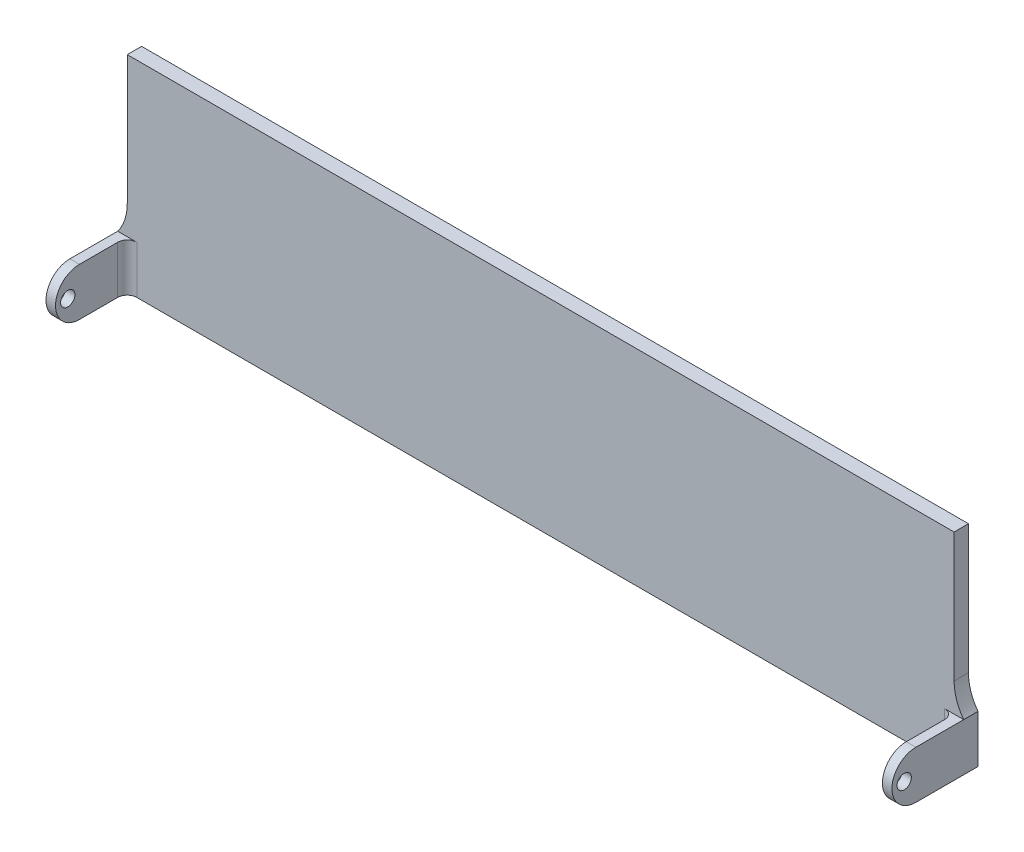
ISO-10303-21;
HEADER;
FILE_DESCRIPTION(('STEP AP214'),'2;1');
FILE_NAME('part.step','',(''),(''),'','','');
FILE_SCHEMA(('AUTOMOTIVE_DESIGN { 1 0 10303 214 1 1 1 1 }'));
ENDSEC;
DATA;
#1=APPLICATION_CONTEXT('core data for automotive mechanical design processes');
#2=APPLICATION_PROTOCOL_DEFINITION('international standard','automotive_design',2000,#1);
#3=PRODUCT_CONTEXT('',#1,'mechanical');
#4=PRODUCT('Part','Part','',(#3));
#5=PRODUCT_RELATED_PRODUCT_CATEGORY('part','',(#4));
#6=PRODUCT_DEFINITION_FORMATION('','',#4);
#7=PRODUCT_DEFINITION_CONTEXT('part definition',#1,'design');
#8=PRODUCT_DEFINITION('design','',#6,#7);
#9=PRODUCT_DEFINITION_SHAPE('','',#8);
#10=(LENGTH_UNIT() NAMED_UNIT(*) SI_UNIT(.MILLI.,.METRE.));
#11=(NAMED_UNIT(*) PLANE_ANGLE_UNIT() SI_UNIT($,.RADIAN.));
#12=(NAMED_UNIT(*) SI_UNIT($,.STERADIAN.) SOLID_ANGLE_UNIT());
#13=UNCERTAINTY_MEASURE_WITH_UNIT(LENGTH_MEASURE(1.E-05),#10,'distance_accuracy_value','');
#14=(GEOMETRIC_REPRESENTATION_CONTEXT(3) GLOBAL_UNCERTAINTY_ASSIGNED_CONTEXT((#13)) GLOBAL_UNIT_ASSIGNED_CONTEXT((#10,
#11,#12)) REPRESENTATION_CONTEXT('',''));
#15=CARTESIAN_POINT('',(0.,0.,0.));
#16=DIRECTION('',(0.,0.,1.));
#17=DIRECTION('',(1.,0.,0.));
#18=AXIS2_PLACEMENT_3D('',#15,#16,#17);
#19=CARTESIAN_POINT('',(86.5,-21.5,3.));
#20=DIRECTION('',(-1.,0.,0.));
#21=DIRECTION('',(0.,0.,1.));
#22=AXIS2_PLACEMENT_3D('',#19,#20,#21);
#23=PLANE('',#22);
#24=DIRECTION('',(0.,1.,0.));
#25=VECTOR('',#24,1.);
#26=CARTESIAN_POINT('',(86.5,-21.5,3.));
#27=LINE('',#26,#25);
#28=CARTESIAN_POINT('',(86.5,-5.49999999999999,3.));
#29=VERTEX_POINT('',#28);
#30=CARTESIAN_POINT('',(86.5,21.5,3.));
#31=VERTEX_POINT('',#30);
#32=EDGE_CURVE('E255',#29,#31,#27,.T.);
#33=ORIENTED_EDGE('',*,*,#32,.F.);
#34=DIRECTION('',(0.,0.,-1.));
#35=VECTOR('',#34,1.);
#36=CARTESIAN_POINT('',(86.5,-5.49999999999999,3.));
#37=LINE('',#36,#35);
#38=CARTESIAN_POINT('',(86.5,-5.49999999999999,0.));
#39=VERTEX_POINT('',#38);
#40=EDGE_CURVE('E300',#29,#39,#37,.T.);
#41=ORIENTED_EDGE('',*,*,#40,.T.);
#42=DIRECTION('',(0.,1.,0.));
#43=VECTOR('',#42,1.);
#44=CARTESIAN_POINT('',(86.5,-21.5,0.));
#45=LINE('',#44,#43);
#46=CARTESIAN_POINT('',(86.5,21.5,0.));
#47=VERTEX_POINT('',#46);
#48=EDGE_CURVE('E245',#39,#47,#45,.T.);
#49=ORIENTED_EDGE('',*,*,#48,.T.);
#50=DIRECTION('',(0.,0.,-1.));
#51=VECTOR('',#50,1.);
#52=CARTESIAN_POINT('',(86.5,21.5,3.));
#53=LINE('',#52,#51);
#54=EDGE_CURVE('E285',#31,#47,#53,.T.);
#55=ORIENTED_EDGE('',*,*,#54,.F.);
#56=EDGE_LOOP('',(#33,#41,#49,#55));
#57=FACE_BOUND('',#56,.T.);
#58=ADVANCED_FACE('F74',(#57),#23,.F.);
#59=CARTESIAN_POINT('',(-86.5,21.5,3.));
#60=DIRECTION('',(0.,-1.,0.));
#61=DIRECTION('',(0.,0.,-1.));
#62=AXIS2_PLACEMENT_3D('',#59,#60,#61);
#63=PLANE('',#62);
#64=DIRECTION('',(-1.,0.,0.));
#65=VECTOR('',#64,1.);
#66=CARTESIAN_POINT('',(-86.5,21.5,0.));
#67=LINE('',#66,#65);
#68=CARTESIAN_POINT('',(-86.5,21.5,0.));
#69=VERTEX_POINT('',#68);
#70=EDGE_CURVE('E273',#47,#69,#67,.T.);
#71=ORIENTED_EDGE('',*,*,#70,.T.);
#72=DIRECTION('',(0.,0.,-1.));
#73=VECTOR('',#72,1.);
#74=CARTESIAN_POINT('',(-86.5,21.5,3.));
#75=LINE('',#74,#73);
#76=CARTESIAN_POINT('',(-86.5,21.5,3.));
#77=VERTEX_POINT('',#76);
#78=EDGE_CURVE('E270',#77,#69,#75,.T.);
#79=ORIENTED_EDGE('',*,*,#78,.F.);
#80=DIRECTION('',(-1.,0.,0.));
#81=VECTOR('',#80,1.);
#82=CARTESIAN_POINT('',(-86.5,21.5,3.));
#83=LINE('',#82,#81);
#84=EDGE_CURVE('E258',#31,#77,#83,.T.);
#85=ORIENTED_EDGE('',*,*,#84,.F.);
#86=ORIENTED_EDGE('',*,*,#54,.T.);
#87=EDGE_LOOP('',(#71,#79,#85,#86));
#88=FACE_BOUND('',#87,.T.);
#89=ADVANCED_FACE('F380',(#88),#63,.F.);
#90=CARTESIAN_POINT('',(-86.5,-21.5,3.));
#91=DIRECTION('',(1.,0.,0.));
#92=DIRECTION('',(0.,0.,-1.));
#93=AXIS2_PLACEMENT_3D('',#90,#91,#92);
#94=PLANE('',#93);
#95=DIRECTION('',(0.,-1.,0.));
#96=VECTOR('',#95,1.);
#97=CARTESIAN_POINT('',(-86.5,-21.5,0.));
#98=LINE('',#97,#96);
#99=CARTESIAN_POINT('',(-86.5,-5.49999999999999,0.));
#100=VERTEX_POINT('',#99);
#101=EDGE_CURVE('E276',#69,#100,#98,.T.);
#102=ORIENTED_EDGE('',*,*,#101,.T.);
#103=DIRECTION('',(0.,0.,1.));
#104=VECTOR('',#103,1.);
#105=CARTESIAN_POINT('',(-86.5,-5.49999999999999,3.));
#106=LINE('',#105,#104);
#107=CARTESIAN_POINT('',(-86.5,-5.49999999999999,3.));
#108=VERTEX_POINT('',#107);
#109=EDGE_CURVE('E289',#100,#108,#106,.T.);
#110=ORIENTED_EDGE('',*,*,#109,.T.);
#111=DIRECTION('',(0.,-1.,0.));
#112=VECTOR('',#111,1.);
#113=CARTESIAN_POINT('',(-86.5,-21.5,3.));
#114=LINE('',#113,#112);
#115=EDGE_CURVE('E262',#77,#108,#114,.T.);
#116=ORIENTED_EDGE('',*,*,#115,.F.);
#117=ORIENTED_EDGE('',*,*,#78,.T.);
#118=EDGE_LOOP('',(#102,#110,#116,#117));
#119=FACE_BOUND('',#118,.T.);
#120=ADVANCED_FACE('F388',(#119),#94,.F.);
#121=CARTESIAN_POINT('',(-86.5,-21.5,3.));
#122=DIRECTION('',(0.,1.,0.));
#123=DIRECTION('',(0.,0.,1.));
#124=AXIS2_PLACEMENT_3D('',#121,#122,#123);
#125=PLANE('',#124);
#126=DIRECTION('',(1.,0.,0.));
#127=VECTOR('',#126,1.);
#128=CARTESIAN_POINT('',(-86.5,-21.5,0.));
#129=LINE('',#128,#127);
#130=CARTESIAN_POINT('',(-88.5,-21.5,0.));
#131=VERTEX_POINT('',#130);
#132=CARTESIAN_POINT('',(88.5,-21.5,0.));
#133=VERTEX_POINT('',#132);
#134=EDGE_CURVE('E259',#131,#133,#129,.T.);
#135=ORIENTED_EDGE('',*,*,#134,.T.);
#136=DIRECTION('',(0.,0.,1.));
#137=VECTOR('',#136,1.);
#138=CARTESIAN_POINT('',(88.5,-21.5,0.));
#139=LINE('',#138,#137);
#140=CARTESIAN_POINT('',(88.5,-21.5,13.));
#141=VERTEX_POINT('',#140);
#142=EDGE_CURVE('E339',#133,#141,#139,.T.);
#143=ORIENTED_EDGE('',*,*,#142,.T.);
#144=DIRECTION('',(-1.,0.,0.));
#145=VECTOR('',#144,1.);
#146=CARTESIAN_POINT('',(88.5,-21.5,13.));
#147=LINE('',#146,#145);
#148=CARTESIAN_POINT('',(86.5,-21.5,13.));
#149=VERTEX_POINT('',#148);
#150=EDGE_CURVE('E206',#141,#149,#147,.T.);
#151=ORIENTED_EDGE('',*,*,#150,.T.);
#152=DIRECTION('',(0.,0.,1.));
#153=VECTOR('',#152,1.);
#154=CARTESIAN_POINT('',(86.5,-21.5,0.));
#155=LINE('',#154,#153);
#156=CARTESIAN_POINT('',(86.5,-21.5,5.));
#157=VERTEX_POINT('',#156);
#158=EDGE_CURVE('E194',#157,#149,#155,.T.);
#159=ORIENTED_EDGE('',*,*,#158,.F.);
#160=CARTESIAN_POINT('',(84.5,-21.5,5.));
#161=DIRECTION('',(0.,1.,0.));
#162=DIRECTION('',(0.,0.,1.));
#163=AXIS2_PLACEMENT_3D('',#160,#161,#162);
#164=CIRCLE('',#163,2.);
#165=CARTESIAN_POINT('',(84.5,-21.5,3.));
#166=VERTEX_POINT('',#165);
#167=EDGE_CURVE('E331',#157,#166,#164,.T.);
#168=ORIENTED_EDGE('',*,*,#167,.T.);
#169=DIRECTION('',(1.,0.,0.));
#170=VECTOR('',#169,1.);
#171=CARTESIAN_POINT('',(-86.5,-21.5,3.));
#172=LINE('',#171,#170);
#173=CARTESIAN_POINT('',(-84.5,-21.5,3.));
#174=VERTEX_POINT('',#173);
#175=EDGE_CURVE('E266',#174,#166,#172,.T.);
#176=ORIENTED_EDGE('',*,*,#175,.F.);
#177=CARTESIAN_POINT('',(-84.5,-21.5,5.));
#178=DIRECTION('',(0.,1.,0.));
#179=DIRECTION('',(0.,0.,1.));
#180=AXIS2_PLACEMENT_3D('',#177,#178,#179);
#181=CIRCLE('',#180,2.);
#182=CARTESIAN_POINT('',(-86.5,-21.5,5.));
#183=VERTEX_POINT('',#182);
#184=EDGE_CURVE('E83',#174,#183,#181,.T.);
#185=ORIENTED_EDGE('',*,*,#184,.T.);
#186=DIRECTION('',(0.,0.,1.));
#187=VECTOR('',#186,1.);
#188=CARTESIAN_POINT('',(-86.5,-21.5,0.));
#189=LINE('',#188,#187);
#190=CARTESIAN_POINT('',(-86.5,-21.5,13.));
#191=VERTEX_POINT('',#190);
#192=EDGE_CURVE('E237',#183,#191,#189,.T.);
#193=ORIENTED_EDGE('',*,*,#192,.T.);
#194=DIRECTION('',(1.,0.,0.));
#195=VECTOR('',#194,1.);
#196=CARTESIAN_POINT('',(-88.5,-21.5,13.));
#197=LINE('',#196,#195);
#198=CARTESIAN_POINT('',(-88.5,-21.5,13.));
#199=VERTEX_POINT('',#198);
#200=EDGE_CURVE('E241',#199,#191,#197,.T.);
#201=ORIENTED_EDGE('',*,*,#200,.F.);
#202=DIRECTION('',(0.,0.,1.));
#203=VECTOR('',#202,1.);
#204=CARTESIAN_POINT('',(-88.5,-21.5,0.));
#205=LINE('',#204,#203);
#206=EDGE_CURVE('E224',#131,#199,#205,.T.);
#207=ORIENTED_EDGE('',*,*,#206,.F.);
#208=EDGE_LOOP('',(#135,#143,#151,#159,#168,#176,#185,#193,#201,#207));
#209=FACE_BOUND('',#208,.T.);
#210=ADVANCED_FACE('F412',(#209),#125,.F.);
#211=CARTESIAN_POINT('',(0.,0.,3.));
#212=DIRECTION('',(0.,0.,-1.));
#213=DIRECTION('',(-1.,0.,0.));
#214=AXIS2_PLACEMENT_3D('',#211,#212,#213);
#215=PLANE('',#214);
#216=ORIENTED_EDGE('',*,*,#175,.T.);
#217=DIRECTION('',(0.,1.,0.));
#218=VECTOR('',#217,1.);
#219=CARTESIAN_POINT('',(84.5,0.,3.));
#220=LINE('',#219,#218);
#221=CARTESIAN_POINT('',(84.5,-11.5,3.));
#222=VERTEX_POINT('',#221);
#223=EDGE_CURVE('E319',#166,#222,#220,.T.);
#224=ORIENTED_EDGE('',*,*,#223,.T.);
#225=DIRECTION('',(-1.,0.,0.));
#226=VECTOR('',#225,1.);
#227=CARTESIAN_POINT('',(0.,-11.5,3.));
#228=LINE('',#227,#226);
#229=CARTESIAN_POINT('',(88.5,-11.5,3.));
#230=VERTEX_POINT('',#229);
#231=EDGE_CURVE('E297',#230,#222,#228,.T.);
#232=ORIENTED_EDGE('',*,*,#231,.F.);
#233=CARTESIAN_POINT('',(96.5,-5.49999999999999,3.));
#234=DIRECTION('',(0.,0.,-1.));
#235=DIRECTION('',(-1.,0.,0.));
#236=AXIS2_PLACEMENT_3D('',#233,#234,#235);
#237=CIRCLE('',#236,10.);
#238=EDGE_CURVE('E309',#230,#29,#237,.T.);
#239=ORIENTED_EDGE('',*,*,#238,.T.);
#240=ORIENTED_EDGE('',*,*,#32,.T.);
#241=ORIENTED_EDGE('',*,*,#84,.T.);
#242=ORIENTED_EDGE('',*,*,#115,.T.);
#243=CARTESIAN_POINT('',(-96.5,-5.49999999999999,3.));
#244=DIRECTION('',(0.,0.,-1.));
#245=DIRECTION('',(-1.,0.,0.));
#246=AXIS2_PLACEMENT_3D('',#243,#244,#245);
#247=CIRCLE('',#246,10.);
#248=CARTESIAN_POINT('',(-88.5,-11.5,3.));
#249=VERTEX_POINT('',#248);
#250=EDGE_CURVE('E303',#108,#249,#247,.T.);
#251=ORIENTED_EDGE('',*,*,#250,.T.);
#252=DIRECTION('',(-1.,0.,0.));
#253=VECTOR('',#252,1.);
#254=CARTESIAN_POINT('',(-88.5,-11.5,3.));
#255=LINE('',#254,#253);
#256=CARTESIAN_POINT('',(-84.5,-11.5,3.));
#257=VERTEX_POINT('',#256);
#258=EDGE_CURVE('E293',#257,#249,#255,.T.);
#259=ORIENTED_EDGE('',*,*,#258,.F.);
#260=DIRECTION('',(0.,-1.,0.));
#261=VECTOR('',#260,1.);
#262=CARTESIAN_POINT('',(-84.5,-21.5,3.));
#263=LINE('',#262,#261);
#264=EDGE_CURVE('E315',#257,#174,#263,.T.);
#265=ORIENTED_EDGE('',*,*,#264,.T.);
#266=EDGE_LOOP('',(#216,#224,#232,#239,#240,#241,#242,#251,#259,#265));
#267=FACE_BOUND('',#266,.T.);
#268=ADVANCED_FACE('F414',(#267),#215,.F.);
#269=CARTESIAN_POINT('',(0.,0.,0.));
#270=DIRECTION('',(0.,0.,-1.));
#271=DIRECTION('',(-1.,0.,0.));
#272=AXIS2_PLACEMENT_3D('',#269,#270,#271);
#273=PLANE('',#272);
#274=ORIENTED_EDGE('',*,*,#48,.F.);
#275=CARTESIAN_POINT('',(96.5,-5.49999999999999,0.));
#276=DIRECTION('',(0.,0.,-1.));
#277=DIRECTION('',(-1.,0.,0.));
#278=AXIS2_PLACEMENT_3D('',#275,#276,#277);
#279=CIRCLE('',#278,10.);
#280=CARTESIAN_POINT('',(88.5,-11.5,0.));
#281=VERTEX_POINT('',#280);
#282=EDGE_CURVE('E312',#39,#281,#279,.F.);
#283=ORIENTED_EDGE('',*,*,#282,.T.);
#284=DIRECTION('',(0.,1.,0.));
#285=VECTOR('',#284,1.);
#286=CARTESIAN_POINT('',(88.5,-21.5,0.));
#287=LINE('',#286,#285);
#288=EDGE_CURVE('E337',#133,#281,#287,.T.);
#289=ORIENTED_EDGE('',*,*,#288,.F.);
#290=ORIENTED_EDGE('',*,*,#134,.F.);
#291=DIRECTION('',(0.,1.,0.));
#292=VECTOR('',#291,1.);
#293=CARTESIAN_POINT('',(-88.5,-21.5,0.));
#294=LINE('',#293,#292);
#295=CARTESIAN_POINT('',(-88.5,-11.5,0.));
#296=VERTEX_POINT('',#295);
#297=EDGE_CURVE('E229',#131,#296,#294,.T.);
#298=ORIENTED_EDGE('',*,*,#297,.T.);
#299=CARTESIAN_POINT('',(-96.5,-5.49999999999999,0.));
#300=DIRECTION('',(0.,0.,-1.));
#301=DIRECTION('',(-1.,0.,0.));
#302=AXIS2_PLACEMENT_3D('',#299,#300,#301);
#303=CIRCLE('',#302,10.);
#304=EDGE_CURVE('E306',#296,#100,#303,.F.);
#305=ORIENTED_EDGE('',*,*,#304,.T.);
#306=ORIENTED_EDGE('',*,*,#101,.F.);
#307=ORIENTED_EDGE('',*,*,#70,.F.);
#308=EDGE_LOOP('',(#274,#283,#289,#290,#298,#305,#306,#307));
#309=FACE_BOUND('',#308,.T.);
#310=ADVANCED_FACE('F435',(#309),#273,.T.);
#311=CARTESIAN_POINT('',(-88.5,-11.5,0.));
#312=DIRECTION('',(0.,1.,0.));
#313=DIRECTION('',(0.,0.,1.));
#314=AXIS2_PLACEMENT_3D('',#311,#312,#313);
#315=PLANE('',#314);
#316=DIRECTION('',(0.,0.,1.));
#317=VECTOR('',#316,1.);
#318=CARTESIAN_POINT('',(-86.5,-11.5,0.));
#319=LINE('',#318,#317);
#320=CARTESIAN_POINT('',(-86.5,-11.5,5.));
#321=VERTEX_POINT('',#320);
#322=CARTESIAN_POINT('',(-86.5,-11.5,13.));
#323=VERTEX_POINT('',#322);
#324=EDGE_CURVE('E234',#321,#323,#319,.T.);
#325=ORIENTED_EDGE('',*,*,#324,.F.);
#326=CARTESIAN_POINT('',(-84.5,-11.5,5.));
#327=DIRECTION('',(0.,1.,0.));
#328=DIRECTION('',(0.,0.,1.));
#329=AXIS2_PLACEMENT_3D('',#326,#327,#328);
#330=CIRCLE('',#329,2.);
#331=EDGE_CURVE('E12',#321,#257,#330,.F.);
#332=ORIENTED_EDGE('',*,*,#331,.T.);
#333=ORIENTED_EDGE('',*,*,#258,.T.);
#334=DIRECTION('',(0.,0.,1.));
#335=VECTOR('',#334,1.);
#336=CARTESIAN_POINT('',(-88.5,-11.5,0.));
#337=LINE('',#336,#335);
#338=CARTESIAN_POINT('',(-88.5,-11.5,13.));
#339=VERTEX_POINT('',#338);
#340=EDGE_CURVE('E225',#249,#339,#337,.T.);
#341=ORIENTED_EDGE('',*,*,#340,.T.);
#342=DIRECTION('',(1.,0.,0.));
#343=VECTOR('',#342,1.);
#344=CARTESIAN_POINT('',(-88.5,-11.5,13.));
#345=LINE('',#344,#343);
#346=EDGE_CURVE('E233',#339,#323,#345,.T.);
#347=ORIENTED_EDGE('',*,*,#346,.T.);
#348=EDGE_LOOP('',(#325,#332,#333,#341,#347));
#349=FACE_BOUND('',#348,.T.);
#350=ADVANCED_FACE('F419',(#349),#315,.T.);
#351=CARTESIAN_POINT('',(-86.5,0.,0.));
#352=DIRECTION('',(-1.,0.,0.));
#353=DIRECTION('',(0.,0.,1.));
#354=AXIS2_PLACEMENT_3D('',#351,#352,#353);
#355=PLANE('',#354);
#356=CARTESIAN_POINT('',(-86.5,-16.5,15.4464731585));
#357=DIRECTION('',(-1.,0.,0.));
#358=DIRECTION('',(0.,0.,1.));
#359=AXIS2_PLACEMENT_3D('',#356,#357,#358);
#360=CIRCLE('',#359,1.5);
#361=CARTESIAN_POINT('',(-86.5,-16.5,16.9464731585));
#362=VERTEX_POINT('',#361);
#363=EDGE_CURVE('E216',#362,#362,#360,.T.);
#364=ORIENTED_EDGE('',*,*,#363,.T.);
#365=EDGE_LOOP('',(#364));
#366=FACE_BOUND('',#365,.T.);
#367=ORIENTED_EDGE('',*,*,#192,.F.);
#368=DIRECTION('',(0.,-1.,0.));
#369=VECTOR('',#368,1.);
#370=CARTESIAN_POINT('',(-86.5,-11.5,5.));
#371=LINE('',#370,#369);
#372=EDGE_CURVE('E96',#183,#321,#371,.F.);
#373=ORIENTED_EDGE('',*,*,#372,.T.);
#374=ORIENTED_EDGE('',*,*,#324,.T.);
#375=CARTESIAN_POINT('',(-86.5,-16.5,13.));
#376=DIRECTION('',(-1.,0.,0.));
#377=DIRECTION('',(0.,0.,1.));
#378=AXIS2_PLACEMENT_3D('',#375,#376,#377);
#379=CIRCLE('',#378,5.);
#380=EDGE_CURVE('E205',#191,#323,#379,.T.);
#381=ORIENTED_EDGE('',*,*,#380,.F.);
#382=EDGE_LOOP('',(#367,#373,#374,#381));
#383=FACE_BOUND('',#382,.T.);
#384=ADVANCED_FACE('F423',(#366,#383),#355,.F.);
#385=CARTESIAN_POINT('',(-88.5,0.,0.));
#386=DIRECTION('',(-1.,0.,0.));
#387=DIRECTION('',(0.,0.,1.));
#388=AXIS2_PLACEMENT_3D('',#385,#386,#387);
#389=PLANE('',#388);
#390=CARTESIAN_POINT('',(-88.5,-16.5,15.4464731585));
#391=DIRECTION('',(-1.,0.,0.));
#392=DIRECTION('',(0.,0.,1.));
#393=AXIS2_PLACEMENT_3D('',#390,#391,#392);
#394=CIRCLE('',#393,1.5);
#395=CARTESIAN_POINT('',(-88.5,-16.5,16.9464731585));
#396=VERTEX_POINT('',#395);
#397=EDGE_CURVE('E351',#396,#396,#394,.T.);
#398=ORIENTED_EDGE('',*,*,#397,.F.);
#399=EDGE_LOOP('',(#398));
#400=FACE_BOUND('',#399,.T.);
#401=ORIENTED_EDGE('',*,*,#206,.T.);
#402=CARTESIAN_POINT('',(-88.5,-16.5,13.));
#403=DIRECTION('',(-1.,0.,0.));
#404=DIRECTION('',(0.,0.,1.));
#405=AXIS2_PLACEMENT_3D('',#402,#403,#404);
#406=CIRCLE('',#405,5.);
#407=EDGE_CURVE('E238',#199,#339,#406,.T.);
#408=ORIENTED_EDGE('',*,*,#407,.T.);
#409=ORIENTED_EDGE('',*,*,#340,.F.);
#410=EDGE_CURVE('E220',#296,#249,#337,.T.);
#411=ORIENTED_EDGE('',*,*,#410,.F.);
#412=ORIENTED_EDGE('',*,*,#297,.F.);
#413=EDGE_LOOP('',(#401,#408,#409,#411,#412));
#414=FACE_BOUND('',#413,.T.);
#415=ADVANCED_FACE('F431',(#400,#414),#389,.T.);
#416=CARTESIAN_POINT('',(-88.5,-16.5,13.));
#417=DIRECTION('',(1.,0.,0.));
#418=DIRECTION('',(0.,0.,-1.));
#419=AXIS2_PLACEMENT_3D('',#416,#417,#418);
#420=CYLINDRICAL_SURFACE('',#419,5.);
#421=ORIENTED_EDGE('',*,*,#380,.T.);
#422=ORIENTED_EDGE('',*,*,#346,.F.);
#423=ORIENTED_EDGE('',*,*,#407,.F.);
#424=ORIENTED_EDGE('',*,*,#200,.T.);
#425=EDGE_LOOP('',(#421,#422,#423,#424));
#426=FACE_BOUND('',#425,.T.);
#427=ADVANCED_FACE('F425',(#426),#420,.T.);
#428=CARTESIAN_POINT('',(86.5,0.,0.));
#429=DIRECTION('',(-1.,0.,0.));
#430=DIRECTION('',(0.,0.,1.));
#431=AXIS2_PLACEMENT_3D('',#428,#429,#430);
#432=PLANE('',#431);
#433=CARTESIAN_POINT('',(86.5,-16.5,15.4464731585));
#434=DIRECTION('',(-1.,0.,0.));
#435=DIRECTION('',(0.,0.,1.));
#436=AXIS2_PLACEMENT_3D('',#433,#434,#435);
#437=CIRCLE('',#436,1.5);
#438=CARTESIAN_POINT('',(86.5,-16.5,16.9464731585));
#439=VERTEX_POINT('',#438);
#440=EDGE_CURVE('E355',#439,#439,#437,.T.);
#441=ORIENTED_EDGE('',*,*,#440,.F.);
#442=EDGE_LOOP('',(#441));
#443=FACE_BOUND('',#442,.T.);
#444=DIRECTION('',(0.,0.,1.));
#445=VECTOR('',#444,1.);
#446=CARTESIAN_POINT('',(86.5,-11.5,0.));
#447=LINE('',#446,#445);
#448=CARTESIAN_POINT('',(86.5,-11.5,5.));
#449=VERTEX_POINT('',#448);
#450=CARTESIAN_POINT('',(86.5,-11.5,13.));
#451=VERTEX_POINT('',#450);
#452=EDGE_CURVE('E200',#449,#451,#447,.T.);
#453=ORIENTED_EDGE('',*,*,#452,.F.);
#454=DIRECTION('',(0.,1.,0.));
#455=VECTOR('',#454,1.);
#456=CARTESIAN_POINT('',(86.5,0.,5.));
#457=LINE('',#456,#455);
#458=EDGE_CURVE('E323',#449,#157,#457,.F.);
#459=ORIENTED_EDGE('',*,*,#458,.T.);
#460=ORIENTED_EDGE('',*,*,#158,.T.);
#461=CARTESIAN_POINT('',(86.5,-16.5,13.));
#462=DIRECTION('',(1.,0.,0.));
#463=DIRECTION('',(0.,0.,-1.));
#464=AXIS2_PLACEMENT_3D('',#461,#462,#463);
#465=CIRCLE('',#464,4.99999999999998);
#466=EDGE_CURVE('E211',#451,#149,#465,.T.);
#467=ORIENTED_EDGE('',*,*,#466,.F.);
#468=EDGE_LOOP('',(#453,#459,#460,#467));
#469=FACE_BOUND('',#468,.T.);
#470=ADVANCED_FACE('F375',(#443,#469),#432,.T.);
#471=CARTESIAN_POINT('',(88.5,-11.5,0.));
#472=DIRECTION('',(0.,-1.,0.));
#473=DIRECTION('',(0.,0.,-1.));
#474=AXIS2_PLACEMENT_3D('',#471,#472,#473);
#475=PLANE('',#474);
#476=DIRECTION('',(0.,0.,1.));
#477=VECTOR('',#476,1.);
#478=CARTESIAN_POINT('',(88.5,-11.5,0.));
#479=LINE('',#478,#477);
#480=CARTESIAN_POINT('',(88.5,-11.5,13.));
#481=VERTEX_POINT('',#480);
#482=EDGE_CURVE('E182',#230,#481,#479,.T.);
#483=ORIENTED_EDGE('',*,*,#482,.F.);
#484=ORIENTED_EDGE('',*,*,#231,.T.);
#485=CARTESIAN_POINT('',(84.5,-11.5,5.));
#486=DIRECTION('',(0.,-1.,0.));
#487=DIRECTION('',(0.,0.,-1.));
#488=AXIS2_PLACEMENT_3D('',#485,#486,#487);
#489=CIRCLE('',#488,2.);
#490=EDGE_CURVE('E328',#222,#449,#489,.T.);
#491=ORIENTED_EDGE('',*,*,#490,.T.);
#492=ORIENTED_EDGE('',*,*,#452,.T.);
#493=DIRECTION('',(-1.,0.,0.));
#494=VECTOR('',#493,1.);
#495=CARTESIAN_POINT('',(88.5,-11.5,13.));
#496=LINE('',#495,#494);
#497=EDGE_CURVE('E197',#481,#451,#496,.T.);
#498=ORIENTED_EDGE('',*,*,#497,.F.);
#499=EDGE_LOOP('',(#483,#484,#491,#492,#498));
#500=FACE_BOUND('',#499,.T.);
#501=ADVANCED_FACE('F198',(#500),#475,.F.);
#502=CARTESIAN_POINT('',(88.5,0.,0.));
#503=DIRECTION('',(-1.,0.,0.));
#504=DIRECTION('',(0.,0.,1.));
#505=AXIS2_PLACEMENT_3D('',#502,#503,#504);
#506=PLANE('',#505);
#507=CARTESIAN_POINT('',(88.5,-16.5,15.4464731585));
#508=DIRECTION('',(1.,0.,0.));
#509=DIRECTION('',(0.,0.,-1.));
#510=AXIS2_PLACEMENT_3D('',#507,#508,#509);
#511=CIRCLE('',#510,1.5);
#512=CARTESIAN_POINT('',(88.5,-16.5,13.9464731585));
#513=VERTEX_POINT('',#512);
#514=EDGE_CURVE('E359',#513,#513,#511,.T.);
#515=ORIENTED_EDGE('',*,*,#514,.F.);
#516=EDGE_LOOP('',(#515));
#517=FACE_BOUND('',#516,.T.);
#518=EDGE_CURVE('E191',#281,#230,#479,.T.);
#519=ORIENTED_EDGE('',*,*,#518,.T.);
#520=ORIENTED_EDGE('',*,*,#482,.T.);
#521=CARTESIAN_POINT('',(88.5,-16.5,13.));
#522=DIRECTION('',(1.,0.,0.));
#523=DIRECTION('',(0.,0.,-1.));
#524=AXIS2_PLACEMENT_3D('',#521,#522,#523);
#525=CIRCLE('',#524,4.99999999999998);
#526=EDGE_CURVE('E187',#481,#141,#525,.T.);
#527=ORIENTED_EDGE('',*,*,#526,.T.);
#528=ORIENTED_EDGE('',*,*,#142,.F.);
#529=ORIENTED_EDGE('',*,*,#288,.T.);
#530=EDGE_LOOP('',(#519,#520,#527,#528,#529));
#531=FACE_BOUND('',#530,.T.);
#532=ADVANCED_FACE('F184',(#517,#531),#506,.F.);
#533=CARTESIAN_POINT('',(88.5,-16.5,13.));
#534=DIRECTION('',(-1.,0.,0.));
#535=DIRECTION('',(0.,0.,1.));
#536=AXIS2_PLACEMENT_3D('',#533,#534,#535);
#537=CYLINDRICAL_SURFACE('',#536,4.99999999999998);
#538=ORIENTED_EDGE('',*,*,#497,.T.);
#539=ORIENTED_EDGE('',*,*,#466,.T.);
#540=ORIENTED_EDGE('',*,*,#150,.F.);
#541=ORIENTED_EDGE('',*,*,#526,.F.);
#542=EDGE_LOOP('',(#538,#539,#540,#541));
#543=FACE_BOUND('',#542,.T.);
#544=ADVANCED_FACE('F208',(#543),#537,.T.);
#545=CARTESIAN_POINT('',(-111.5,-16.5,15.4464731585));
#546=DIRECTION('',(1.,0.,0.));
#547=DIRECTION('',(0.,0.,-1.));
#548=AXIS2_PLACEMENT_3D('',#545,#546,#547);
#549=CYLINDRICAL_SURFACE('',#548,1.5);
#550=ORIENTED_EDGE('',*,*,#440,.T.);
#551=EDGE_LOOP('',(#550));
#552=FACE_BOUND('',#551,.T.);
#553=ORIENTED_EDGE('',*,*,#514,.T.);
#554=EDGE_LOOP('',(#553));
#555=FACE_BOUND('',#554,.T.);
#556=ADVANCED_FACE('F364',(#552,#555),#549,.F.);
#557=ORIENTED_EDGE('',*,*,#397,.T.);
#558=EDGE_LOOP('',(#557));
#559=FACE_BOUND('',#558,.T.);
#560=ORIENTED_EDGE('',*,*,#363,.F.);
#561=EDGE_LOOP('',(#560));
#562=FACE_BOUND('',#561,.T.);
#563=ADVANCED_FACE('F397',(#559,#562),#549,.F.);
#564=CARTESIAN_POINT('',(-96.5,-5.49999999999999,0.));
#565=DIRECTION('',(0.,0.,1.));
#566=DIRECTION('',(1.,0.,0.));
#567=AXIS2_PLACEMENT_3D('',#564,#565,#566);
#568=CYLINDRICAL_SURFACE('',#567,10.);
#569=ORIENTED_EDGE('',*,*,#304,.F.);
#570=ORIENTED_EDGE('',*,*,#410,.T.);
#571=ORIENTED_EDGE('',*,*,#250,.F.);
#572=ORIENTED_EDGE('',*,*,#109,.F.);
#573=EDGE_LOOP('',(#569,#570,#571,#572));
#574=FACE_BOUND('',#573,.T.);
#575=ADVANCED_FACE('F394',(#574),#568,.F.);
#576=CARTESIAN_POINT('',(96.5,-5.49999999999999,0.));
#577=DIRECTION('',(0.,0.,-1.));
#578=DIRECTION('',(-1.,0.,0.));
#579=AXIS2_PLACEMENT_3D('',#576,#577,#578);
#580=CYLINDRICAL_SURFACE('',#579,10.);
#581=ORIENTED_EDGE('',*,*,#282,.F.);
#582=ORIENTED_EDGE('',*,*,#40,.F.);
#583=ORIENTED_EDGE('',*,*,#238,.F.);
#584=ORIENTED_EDGE('',*,*,#518,.F.);
#585=EDGE_LOOP('',(#581,#582,#583,#584));
#586=FACE_BOUND('',#585,.T.);
#587=ADVANCED_FACE('F396',(#586),#580,.F.);
#588=CARTESIAN_POINT('',(84.5,0.,5.));
#589=DIRECTION('',(0.,1.,0.));
#590=DIRECTION('',(0.,0.,1.));
#591=AXIS2_PLACEMENT_3D('',#588,#589,#590);
#592=CYLINDRICAL_SURFACE('',#591,2.);
#593=ORIENTED_EDGE('',*,*,#167,.F.);
#594=ORIENTED_EDGE('',*,*,#458,.F.);
#595=ORIENTED_EDGE('',*,*,#490,.F.);
#596=ORIENTED_EDGE('',*,*,#223,.F.);
#597=EDGE_LOOP('',(#593,#594,#595,#596));
#598=FACE_BOUND('',#597,.T.);
#599=ADVANCED_FACE('F400',(#598),#592,.F.);
#600=CARTESIAN_POINT('',(-84.5,0.,5.));
#601=DIRECTION('',(0.,1.,0.));
#602=DIRECTION('',(0.,0.,1.));
#603=AXIS2_PLACEMENT_3D('',#600,#601,#602);
#604=CYLINDRICAL_SURFACE('',#603,2.);
#605=ORIENTED_EDGE('',*,*,#331,.F.);
#606=ORIENTED_EDGE('',*,*,#372,.F.);
#607=ORIENTED_EDGE('',*,*,#184,.F.);
#608=ORIENTED_EDGE('',*,*,#264,.F.);
#609=EDGE_LOOP('',(#605,#606,#607,#608));
#610=FACE_BOUND('',#609,.T.);
#611=ADVANCED_FACE('F76',(#610),#604,.F.);
#612=CLOSED_SHELL('',(#58,#89,#120,#210,#268,#310,#350,#384,#415,#427,#470,#501,#532,#544,#556,
#563,#575,#587,#599,#611));
#613=MANIFOLD_SOLID_BREP('B2',#612);
#614=ADVANCED_BREP_SHAPE_REPRESENTATION('',(#18,#613),#14);
#615=SHAPE_DEFINITION_REPRESENTATION(#9,#614);
ENDSEC;
END-ISO-10303-21;
